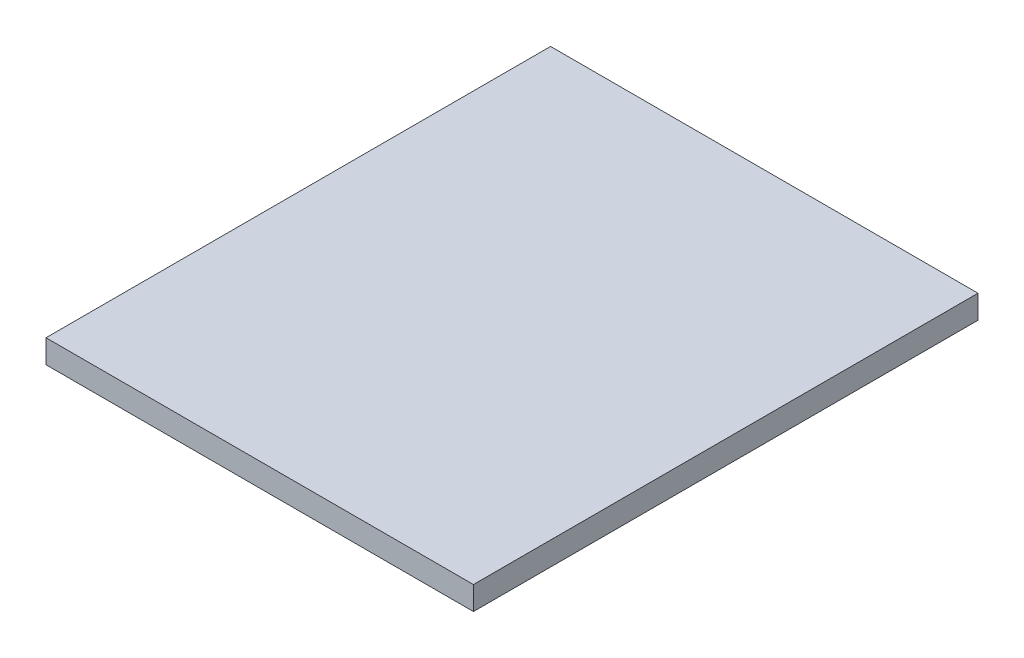
ISO-10303-21;
HEADER;
FILE_DESCRIPTION(('STEP AP214'),'2;1');
FILE_NAME('part.step','',(''),(''),'','','');
FILE_SCHEMA(('AUTOMOTIVE_DESIGN { 1 0 10303 214 1 1 1 1 }'));
ENDSEC;
DATA;
#1=APPLICATION_CONTEXT('core data for automotive mechanical design processes');
#2=APPLICATION_PROTOCOL_DEFINITION('international standard','automotive_design',2000,#1);
#3=PRODUCT_CONTEXT('',#1,'mechanical');
#4=PRODUCT('Part','Part','',(#3));
#5=PRODUCT_RELATED_PRODUCT_CATEGORY('part','',(#4));
#6=PRODUCT_DEFINITION_FORMATION('','',#4);
#7=PRODUCT_DEFINITION_CONTEXT('part definition',#1,'design');
#8=PRODUCT_DEFINITION('design','',#6,#7);
#9=PRODUCT_DEFINITION_SHAPE('','',#8);
#10=(LENGTH_UNIT() NAMED_UNIT(*) SI_UNIT(.MILLI.,.METRE.));
#11=(NAMED_UNIT(*) PLANE_ANGLE_UNIT() SI_UNIT($,.RADIAN.));
#12=(NAMED_UNIT(*) SI_UNIT($,.STERADIAN.) SOLID_ANGLE_UNIT());
#13=UNCERTAINTY_MEASURE_WITH_UNIT(LENGTH_MEASURE(1.E-05),#10,'distance_accuracy_value','');
#14=(GEOMETRIC_REPRESENTATION_CONTEXT(3) GLOBAL_UNCERTAINTY_ASSIGNED_CONTEXT((#13)) GLOBAL_UNIT_ASSIGNED_CONTEXT((#10,
#11,#12)) REPRESENTATION_CONTEXT('',''));
#15=CARTESIAN_POINT('',(0.,0.,0.));
#16=DIRECTION('',(0.,0.,1.));
#17=DIRECTION('',(1.,0.,0.));
#18=AXIS2_PLACEMENT_3D('',#15,#16,#17);
#19=CARTESIAN_POINT('',(-23.171743834612,2.54,27.3522130831245));
#20=DIRECTION('',(1.,0.,0.));
#21=DIRECTION('',(0.,0.,-1.));
#22=AXIS2_PLACEMENT_3D('',#19,#20,#21);
#23=PLANE('',#22);
#24=DIRECTION('',(0.,0.,1.));
#25=VECTOR('',#24,1.);
#26=CARTESIAN_POINT('',(-23.171743834612,0.,27.3522130831245));
#27=LINE('',#26,#25);
#28=CARTESIAN_POINT('',(-23.171743834612,0.,-27.3522130831245));
#29=VERTEX_POINT('',#28);
#30=CARTESIAN_POINT('',(-23.171743834612,0.,27.3522130831245));
#31=VERTEX_POINT('',#30);
#32=EDGE_CURVE('E104',#29,#31,#27,.T.);
#33=ORIENTED_EDGE('',*,*,#32,.T.);
#34=DIRECTION('',(0.,-1.,0.));
#35=VECTOR('',#34,1.);
#36=CARTESIAN_POINT('',(-23.171743834612,2.54,27.3522130831245));
#37=LINE('',#36,#35);
#38=CARTESIAN_POINT('',(-23.171743834612,2.54,27.3522130831245));
#39=VERTEX_POINT('',#38);
#40=EDGE_CURVE('E11',#39,#31,#37,.T.);
#41=ORIENTED_EDGE('',*,*,#40,.F.);
#42=DIRECTION('',(0.,0.,1.));
#43=VECTOR('',#42,1.);
#44=CARTESIAN_POINT('',(-23.171743834612,2.54,27.3522130831245));
#45=LINE('',#44,#43);
#46=CARTESIAN_POINT('',(-23.171743834612,2.54,-27.3522130831245));
#47=VERTEX_POINT('',#46);
#48=EDGE_CURVE('E92',#47,#39,#45,.T.);
#49=ORIENTED_EDGE('',*,*,#48,.F.);
#50=DIRECTION('',(0.,-1.,0.));
#51=VECTOR('',#50,1.);
#52=CARTESIAN_POINT('',(-23.171743834612,2.54,-27.3522130831245));
#53=LINE('',#52,#51);
#54=EDGE_CURVE('E100',#47,#29,#53,.T.);
#55=ORIENTED_EDGE('',*,*,#54,.T.);
#56=EDGE_LOOP('',(#33,#41,#49,#55));
#57=FACE_BOUND('',#56,.T.);
#58=ADVANCED_FACE('F41',(#57),#23,.F.);
#59=CARTESIAN_POINT('',(23.171743834612,2.54,27.3522130831245));
#60=DIRECTION('',(0.,0.,-1.));
#61=DIRECTION('',(-1.,0.,0.));
#62=AXIS2_PLACEMENT_3D('',#59,#60,#61);
#63=PLANE('',#62);
#64=DIRECTION('',(1.,0.,0.));
#65=VECTOR('',#64,1.);
#66=CARTESIAN_POINT('',(23.171743834612,0.,27.3522130831245));
#67=LINE('',#66,#65);
#68=CARTESIAN_POINT('',(23.171743834612,0.,27.3522130831245));
#69=VERTEX_POINT('',#68);
#70=EDGE_CURVE('E96',#31,#69,#67,.T.);
#71=ORIENTED_EDGE('',*,*,#70,.T.);
#72=DIRECTION('',(0.,-1.,0.));
#73=VECTOR('',#72,1.);
#74=CARTESIAN_POINT('',(23.171743834612,2.54,27.3522130831245));
#75=LINE('',#74,#73);
#76=CARTESIAN_POINT('',(23.171743834612,2.54,27.3522130831245));
#77=VERTEX_POINT('',#76);
#78=EDGE_CURVE('E49',#77,#69,#75,.T.);
#79=ORIENTED_EDGE('',*,*,#78,.F.);
#80=DIRECTION('',(1.,0.,0.));
#81=VECTOR('',#80,1.);
#82=CARTESIAN_POINT('',(23.171743834612,2.54,27.3522130831245));
#83=LINE('',#82,#81);
#84=EDGE_CURVE('E87',#39,#77,#83,.T.);
#85=ORIENTED_EDGE('',*,*,#84,.F.);
#86=ORIENTED_EDGE('',*,*,#40,.T.);
#87=EDGE_LOOP('',(#71,#79,#85,#86));
#88=FACE_BOUND('',#87,.T.);
#89=ADVANCED_FACE('F95',(#88),#63,.F.);
#90=CARTESIAN_POINT('',(23.171743834612,2.54,27.3522130831245));
#91=DIRECTION('',(-1.,0.,0.));
#92=DIRECTION('',(0.,0.,1.));
#93=AXIS2_PLACEMENT_3D('',#90,#91,#92);
#94=PLANE('',#93);
#95=DIRECTION('',(0.,0.,-1.));
#96=VECTOR('',#95,1.);
#97=CARTESIAN_POINT('',(23.171743834612,0.,27.3522130831245));
#98=LINE('',#97,#96);
#99=CARTESIAN_POINT('',(23.171743834612,0.,-27.3522130831245));
#100=VERTEX_POINT('',#99);
#101=EDGE_CURVE('E74',#69,#100,#98,.T.);
#102=ORIENTED_EDGE('',*,*,#101,.T.);
#103=DIRECTION('',(0.,-1.,0.));
#104=VECTOR('',#103,1.);
#105=CARTESIAN_POINT('',(23.171743834612,2.54,-27.3522130831245));
#106=LINE('',#105,#104);
#107=CARTESIAN_POINT('',(23.171743834612,2.54,-27.3522130831245));
#108=VERTEX_POINT('',#107);
#109=EDGE_CURVE('E97',#108,#100,#106,.T.);
#110=ORIENTED_EDGE('',*,*,#109,.F.);
#111=DIRECTION('',(0.,0.,-1.));
#112=VECTOR('',#111,1.);
#113=CARTESIAN_POINT('',(23.171743834612,2.54,27.3522130831245));
#114=LINE('',#113,#112);
#115=EDGE_CURVE('E90',#77,#108,#114,.T.);
#116=ORIENTED_EDGE('',*,*,#115,.F.);
#117=ORIENTED_EDGE('',*,*,#78,.T.);
#118=EDGE_LOOP('',(#102,#110,#116,#117));
#119=FACE_BOUND('',#118,.T.);
#120=ADVANCED_FACE('F98',(#119),#94,.F.);
#121=CARTESIAN_POINT('',(23.171743834612,2.54,-27.3522130831245));
#122=DIRECTION('',(0.,0.,1.));
#123=DIRECTION('',(1.,0.,0.));
#124=AXIS2_PLACEMENT_3D('',#121,#122,#123);
#125=PLANE('',#124);
#126=DIRECTION('',(-1.,0.,0.));
#127=VECTOR('',#126,1.);
#128=CARTESIAN_POINT('',(23.171743834612,0.,-27.3522130831245));
#129=LINE('',#128,#127);
#130=EDGE_CURVE('E80',#100,#29,#129,.T.);
#131=ORIENTED_EDGE('',*,*,#130,.T.);
#132=ORIENTED_EDGE('',*,*,#54,.F.);
#133=DIRECTION('',(-1.,0.,0.));
#134=VECTOR('',#133,1.);
#135=CARTESIAN_POINT('',(23.171743834612,2.54,-27.3522130831245));
#136=LINE('',#135,#134);
#137=EDGE_CURVE('E57',#108,#47,#136,.T.);
#138=ORIENTED_EDGE('',*,*,#137,.F.);
#139=ORIENTED_EDGE('',*,*,#109,.T.);
#140=EDGE_LOOP('',(#131,#132,#138,#139));
#141=FACE_BOUND('',#140,.T.);
#142=ADVANCED_FACE('F111',(#141),#125,.F.);
#143=CARTESIAN_POINT('',(0.,2.54,0.));
#144=DIRECTION('',(0.,1.,0.));
#145=DIRECTION('',(0.,0.,1.));
#146=AXIS2_PLACEMENT_3D('',#143,#144,#145);
#147=PLANE('',#146);
#148=ORIENTED_EDGE('',*,*,#48,.T.);
#149=ORIENTED_EDGE('',*,*,#84,.T.);
#150=ORIENTED_EDGE('',*,*,#115,.T.);
#151=ORIENTED_EDGE('',*,*,#137,.T.);
#152=EDGE_LOOP('',(#148,#149,#150,#151));
#153=FACE_BOUND('',#152,.T.);
#154=ADVANCED_FACE('F88',(#153),#147,.T.);
#155=CARTESIAN_POINT('',(0.,0.,0.));
#156=DIRECTION('',(0.,1.,0.));
#157=DIRECTION('',(0.,0.,1.));
#158=AXIS2_PLACEMENT_3D('',#155,#156,#157);
#159=PLANE('',#158);
#160=ORIENTED_EDGE('',*,*,#32,.F.);
#161=ORIENTED_EDGE('',*,*,#130,.F.);
#162=ORIENTED_EDGE('',*,*,#101,.F.);
#163=ORIENTED_EDGE('',*,*,#70,.F.);
#164=EDGE_LOOP('',(#160,#161,#162,#163));
#165=FACE_BOUND('',#164,.T.);
#166=ADVANCED_FACE('F114',(#165),#159,.F.);
#167=CLOSED_SHELL('',(#58,#89,#120,#142,#154,#166));
#168=MANIFOLD_SOLID_BREP('B2',#167);
#169=ADVANCED_BREP_SHAPE_REPRESENTATION('',(#18,#168),#14);
#170=SHAPE_DEFINITION_REPRESENTATION(#9,#169);
ENDSEC;
END-ISO-10303-21;
